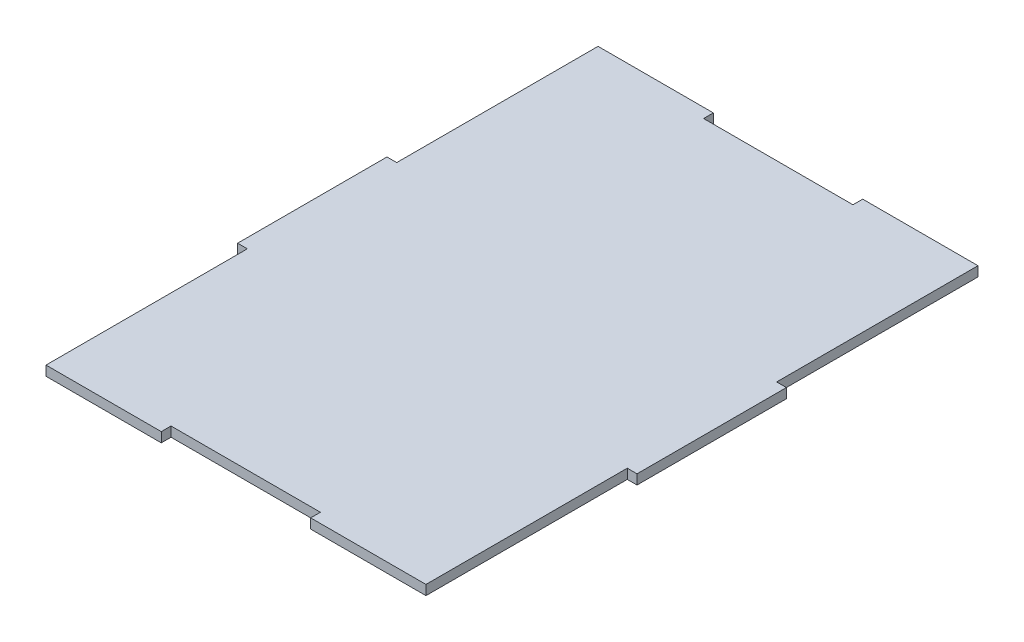
ISO-10303-21;
HEADER;
FILE_DESCRIPTION(('STEP AP214'),'2;1');
FILE_NAME('part.step','',(''),(''),'','','');
FILE_SCHEMA(('AUTOMOTIVE_DESIGN { 1 0 10303 214 1 1 1 1 }'));
ENDSEC;
DATA;
#1=APPLICATION_CONTEXT('core data for automotive mechanical design processes');
#2=APPLICATION_PROTOCOL_DEFINITION('international standard','automotive_design',2000,#1);
#3=PRODUCT_CONTEXT('',#1,'mechanical');
#4=PRODUCT('Part','Part','',(#3));
#5=PRODUCT_RELATED_PRODUCT_CATEGORY('part','',(#4));
#6=PRODUCT_DEFINITION_FORMATION('','',#4);
#7=PRODUCT_DEFINITION_CONTEXT('part definition',#1,'design');
#8=PRODUCT_DEFINITION('design','',#6,#7);
#9=PRODUCT_DEFINITION_SHAPE('','',#8);
#10=(LENGTH_UNIT() NAMED_UNIT(*) SI_UNIT(.MILLI.,.METRE.));
#11=(NAMED_UNIT(*) PLANE_ANGLE_UNIT() SI_UNIT($,.RADIAN.));
#12=(NAMED_UNIT(*) SI_UNIT($,.STERADIAN.) SOLID_ANGLE_UNIT());
#13=UNCERTAINTY_MEASURE_WITH_UNIT(LENGTH_MEASURE(1.E-05),#10,'distance_accuracy_value','');
#14=(GEOMETRIC_REPRESENTATION_CONTEXT(3) GLOBAL_UNCERTAINTY_ASSIGNED_CONTEXT((#13)) GLOBAL_UNIT_ASSIGNED_CONTEXT((#10,
#11,#12)) REPRESENTATION_CONTEXT('',''));
#15=CARTESIAN_POINT('',(0.,0.,0.));
#16=DIRECTION('',(0.,0.,1.));
#17=DIRECTION('',(1.,0.,0.));
#18=AXIS2_PLACEMENT_3D('',#15,#16,#17);
#19=CARTESIAN_POINT('',(3.00000000000004,3.,-170.));
#20=DIRECTION('',(1.,0.,0.));
#21=DIRECTION('',(0.,0.,-1.));
#22=AXIS2_PLACEMENT_3D('',#19,#20,#21);
#23=PLANE('',#22);
#24=DIRECTION('',(0.,0.,1.));
#25=VECTOR('',#24,1.);
#26=CARTESIAN_POINT('',(3.00000000000004,0.,-170.));
#27=LINE('',#26,#25);
#28=CARTESIAN_POINT('',(3.00000000000004,0.,-170.));
#29=VERTEX_POINT('',#28);
#30=CARTESIAN_POINT('',(3.,0.,-108.));
#31=VERTEX_POINT('',#30);
#32=EDGE_CURVE('E212',#29,#31,#27,.T.);
#33=ORIENTED_EDGE('',*,*,#32,.T.);
#34=DIRECTION('',(0.,-1.,0.));
#35=VECTOR('',#34,1.);
#36=CARTESIAN_POINT('',(3.,3.,-108.));
#37=LINE('',#36,#35);
#38=CARTESIAN_POINT('',(3.,3.,-108.));
#39=VERTEX_POINT('',#38);
#40=EDGE_CURVE('E11',#39,#31,#37,.T.);
#41=ORIENTED_EDGE('',*,*,#40,.F.);
#42=DIRECTION('',(0.,0.,1.));
#43=VECTOR('',#42,1.);
#44=CARTESIAN_POINT('',(3.00000000000004,3.,-170.));
#45=LINE('',#44,#43);
#46=CARTESIAN_POINT('',(3.00000000000004,3.,-170.));
#47=VERTEX_POINT('',#46);
#48=EDGE_CURVE('E270',#47,#39,#45,.T.);
#49=ORIENTED_EDGE('',*,*,#48,.F.);
#50=DIRECTION('',(0.,-1.,0.));
#51=VECTOR('',#50,1.);
#52=CARTESIAN_POINT('',(3.00000000000004,3.,-170.));
#53=LINE('',#52,#51);
#54=EDGE_CURVE('E208',#47,#29,#53,.T.);
#55=ORIENTED_EDGE('',*,*,#54,.T.);
#56=EDGE_LOOP('',(#33,#41,#49,#55));
#57=FACE_BOUND('',#56,.T.);
#58=ADVANCED_FACE('F39',(#57),#23,.F.);
#59=CARTESIAN_POINT('',(3.,3.,-108.));
#60=DIRECTION('',(0.,0.,1.));
#61=DIRECTION('',(1.,0.,0.));
#62=AXIS2_PLACEMENT_3D('',#59,#60,#61);
#63=PLANE('',#62);
#64=DIRECTION('',(-1.,0.,0.));
#65=VECTOR('',#64,1.);
#66=CARTESIAN_POINT('',(3.,0.,-108.));
#67=LINE('',#66,#65);
#68=CARTESIAN_POINT('',(0.,0.,-108.));
#69=VERTEX_POINT('',#68);
#70=EDGE_CURVE('E216',#31,#69,#67,.T.);
#71=ORIENTED_EDGE('',*,*,#70,.T.);
#72=DIRECTION('',(0.,-1.,0.));
#73=VECTOR('',#72,1.);
#74=CARTESIAN_POINT('',(0.,3.,-108.));
#75=LINE('',#74,#73);
#76=CARTESIAN_POINT('',(0.,3.,-108.));
#77=VERTEX_POINT('',#76);
#78=EDGE_CURVE('E48',#77,#69,#75,.T.);
#79=ORIENTED_EDGE('',*,*,#78,.F.);
#80=DIRECTION('',(-1.,0.,0.));
#81=VECTOR('',#80,1.);
#82=CARTESIAN_POINT('',(3.,3.,-108.));
#83=LINE('',#82,#81);
#84=EDGE_CURVE('E135',#39,#77,#83,.T.);
#85=ORIENTED_EDGE('',*,*,#84,.F.);
#86=ORIENTED_EDGE('',*,*,#40,.T.);
#87=EDGE_LOOP('',(#71,#79,#85,#86));
#88=FACE_BOUND('',#87,.T.);
#89=ADVANCED_FACE('F420',(#88),#63,.F.);
#90=CARTESIAN_POINT('',(0.,3.,-108.));
#91=DIRECTION('',(1.,0.,0.));
#92=DIRECTION('',(0.,0.,-1.));
#93=AXIS2_PLACEMENT_3D('',#90,#91,#92);
#94=PLANE('',#93);
#95=DIRECTION('',(0.,0.,1.));
#96=VECTOR('',#95,1.);
#97=CARTESIAN_POINT('',(0.,0.,-108.));
#98=LINE('',#97,#96);
#99=CARTESIAN_POINT('',(0.,0.,-62.));
#100=VERTEX_POINT('',#99);
#101=EDGE_CURVE('E219',#69,#100,#98,.T.);
#102=ORIENTED_EDGE('',*,*,#101,.T.);
#103=DIRECTION('',(0.,-1.,0.));
#104=VECTOR('',#103,1.);
#105=CARTESIAN_POINT('',(0.,3.,-62.));
#106=LINE('',#105,#104);
#107=CARTESIAN_POINT('',(0.,3.,-62.));
#108=VERTEX_POINT('',#107);
#109=EDGE_CURVE('E329',#108,#100,#106,.T.);
#110=ORIENTED_EDGE('',*,*,#109,.F.);
#111=DIRECTION('',(0.,0.,1.));
#112=VECTOR('',#111,1.);
#113=CARTESIAN_POINT('',(0.,3.,-108.));
#114=LINE('',#113,#112);
#115=EDGE_CURVE('E339',#77,#108,#114,.T.);
#116=ORIENTED_EDGE('',*,*,#115,.F.);
#117=ORIENTED_EDGE('',*,*,#78,.T.);
#118=EDGE_LOOP('',(#102,#110,#116,#117));
#119=FACE_BOUND('',#118,.T.);
#120=ADVANCED_FACE('F337',(#119),#94,.F.);
#121=CARTESIAN_POINT('',(3.,3.,-62.));
#122=DIRECTION('',(0.,0.,-1.));
#123=DIRECTION('',(-1.,0.,0.));
#124=AXIS2_PLACEMENT_3D('',#121,#122,#123);
#125=PLANE('',#124);
#126=DIRECTION('',(1.,0.,0.));
#127=VECTOR('',#126,1.);
#128=CARTESIAN_POINT('',(3.,0.,-62.));
#129=LINE('',#128,#127);
#130=CARTESIAN_POINT('',(3.,0.,-62.));
#131=VERTEX_POINT('',#130);
#132=EDGE_CURVE('E222',#100,#131,#129,.T.);
#133=ORIENTED_EDGE('',*,*,#132,.T.);
#134=DIRECTION('',(0.,-1.,0.));
#135=VECTOR('',#134,1.);
#136=CARTESIAN_POINT('',(3.,3.,-62.));
#137=LINE('',#136,#135);
#138=CARTESIAN_POINT('',(3.,3.,-62.));
#139=VERTEX_POINT('',#138);
#140=EDGE_CURVE('E325',#139,#131,#137,.T.);
#141=ORIENTED_EDGE('',*,*,#140,.F.);
#142=DIRECTION('',(1.,0.,0.));
#143=VECTOR('',#142,1.);
#144=CARTESIAN_POINT('',(3.,3.,-62.));
#145=LINE('',#144,#143);
#146=EDGE_CURVE('E358',#108,#139,#145,.T.);
#147=ORIENTED_EDGE('',*,*,#146,.F.);
#148=ORIENTED_EDGE('',*,*,#109,.T.);
#149=EDGE_LOOP('',(#133,#141,#147,#148));
#150=FACE_BOUND('',#149,.T.);
#151=ADVANCED_FACE('F348',(#150),#125,.F.);
#152=CARTESIAN_POINT('',(3.,3.,-62.));
#153=DIRECTION('',(1.,0.,0.));
#154=DIRECTION('',(0.,0.,-1.));
#155=AXIS2_PLACEMENT_3D('',#152,#153,#154);
#156=PLANE('',#155);
#157=DIRECTION('',(0.,0.,1.));
#158=VECTOR('',#157,1.);
#159=CARTESIAN_POINT('',(3.,0.,-62.));
#160=LINE('',#159,#158);
#161=CARTESIAN_POINT('',(3.,0.,0.));
#162=VERTEX_POINT('',#161);
#163=EDGE_CURVE('E225',#131,#162,#160,.T.);
#164=ORIENTED_EDGE('',*,*,#163,.T.);
#165=DIRECTION('',(0.,-1.,0.));
#166=VECTOR('',#165,1.);
#167=CARTESIAN_POINT('',(3.,3.,0.));
#168=LINE('',#167,#166);
#169=CARTESIAN_POINT('',(3.,3.,0.));
#170=VERTEX_POINT('',#169);
#171=EDGE_CURVE('E321',#170,#162,#168,.T.);
#172=ORIENTED_EDGE('',*,*,#171,.F.);
#173=DIRECTION('',(0.,0.,1.));
#174=VECTOR('',#173,1.);
#175=CARTESIAN_POINT('',(3.,3.,-62.));
#176=LINE('',#175,#174);
#177=EDGE_CURVE('E354',#139,#170,#176,.T.);
#178=ORIENTED_EDGE('',*,*,#177,.F.);
#179=ORIENTED_EDGE('',*,*,#140,.T.);
#180=EDGE_LOOP('',(#164,#172,#178,#179));
#181=FACE_BOUND('',#180,.T.);
#182=ADVANCED_FACE('F352',(#181),#156,.F.);
#183=CARTESIAN_POINT('',(3.,3.,0.));
#184=DIRECTION('',(0.,0.,-1.));
#185=DIRECTION('',(-1.,0.,0.));
#186=AXIS2_PLACEMENT_3D('',#183,#184,#185);
#187=PLANE('',#186);
#188=DIRECTION('',(1.,0.,0.));
#189=VECTOR('',#188,1.);
#190=CARTESIAN_POINT('',(3.,0.,0.));
#191=LINE('',#190,#189);
#192=CARTESIAN_POINT('',(38.5,0.,0.));
#193=VERTEX_POINT('',#192);
#194=EDGE_CURVE('E228',#162,#193,#191,.T.);
#195=ORIENTED_EDGE('',*,*,#194,.T.);
#196=DIRECTION('',(0.,-1.,0.));
#197=VECTOR('',#196,1.);
#198=CARTESIAN_POINT('',(38.5,3.,0.));
#199=LINE('',#198,#197);
#200=CARTESIAN_POINT('',(38.5,3.,0.));
#201=VERTEX_POINT('',#200);
#202=EDGE_CURVE('E317',#201,#193,#199,.T.);
#203=ORIENTED_EDGE('',*,*,#202,.F.);
#204=DIRECTION('',(1.,0.,0.));
#205=VECTOR('',#204,1.);
#206=CARTESIAN_POINT('',(3.,3.,0.));
#207=LINE('',#206,#205);
#208=EDGE_CURVE('E357',#170,#201,#207,.T.);
#209=ORIENTED_EDGE('',*,*,#208,.F.);
#210=ORIENTED_EDGE('',*,*,#171,.T.);
#211=EDGE_LOOP('',(#195,#203,#209,#210));
#212=FACE_BOUND('',#211,.T.);
#213=ADVANCED_FACE('F433',(#212),#187,.F.);
#214=CARTESIAN_POINT('',(38.5,3.,0.));
#215=DIRECTION('',(-1.,0.,0.));
#216=DIRECTION('',(0.,0.,1.));
#217=AXIS2_PLACEMENT_3D('',#214,#215,#216);
#218=PLANE('',#217);
#219=DIRECTION('',(0.,0.,-1.));
#220=VECTOR('',#219,1.);
#221=CARTESIAN_POINT('',(38.5,0.,0.));
#222=LINE('',#221,#220);
#223=CARTESIAN_POINT('',(38.5,0.,-3.00000000000003));
#224=VERTEX_POINT('',#223);
#225=EDGE_CURVE('E231',#193,#224,#222,.T.);
#226=ORIENTED_EDGE('',*,*,#225,.T.);
#227=DIRECTION('',(0.,-1.,0.));
#228=VECTOR('',#227,1.);
#229=CARTESIAN_POINT('',(38.5,3.,-3.00000000000003));
#230=LINE('',#229,#228);
#231=CARTESIAN_POINT('',(38.5,3.,-3.00000000000003));
#232=VERTEX_POINT('',#231);
#233=EDGE_CURVE('E313',#232,#224,#230,.T.);
#234=ORIENTED_EDGE('',*,*,#233,.F.);
#235=DIRECTION('',(0.,0.,-1.));
#236=VECTOR('',#235,1.);
#237=CARTESIAN_POINT('',(38.5,3.,0.));
#238=LINE('',#237,#236);
#239=EDGE_CURVE('E362',#201,#232,#238,.T.);
#240=ORIENTED_EDGE('',*,*,#239,.F.);
#241=ORIENTED_EDGE('',*,*,#202,.T.);
#242=EDGE_LOOP('',(#226,#234,#240,#241));
#243=FACE_BOUND('',#242,.T.);
#244=ADVANCED_FACE('F436',(#243),#218,.F.);
#245=CARTESIAN_POINT('',(84.5,3.,-3.00000000000004));
#246=DIRECTION('',(0.,0.,-1.));
#247=DIRECTION('',(-1.,0.,0.));
#248=AXIS2_PLACEMENT_3D('',#245,#246,#247);
#249=PLANE('',#248);
#250=DIRECTION('',(1.,0.,0.));
#251=VECTOR('',#250,1.);
#252=CARTESIAN_POINT('',(84.5,0.,-3.00000000000004));
#253=LINE('',#252,#251);
#254=CARTESIAN_POINT('',(84.5,0.,-3.00000000000004));
#255=VERTEX_POINT('',#254);
#256=EDGE_CURVE('E234',#224,#255,#253,.T.);
#257=ORIENTED_EDGE('',*,*,#256,.T.);
#258=DIRECTION('',(0.,-1.,0.));
#259=VECTOR('',#258,1.);
#260=CARTESIAN_POINT('',(84.5,3.,-3.00000000000004));
#261=LINE('',#260,#259);
#262=CARTESIAN_POINT('',(84.5,3.,-3.00000000000004));
#263=VERTEX_POINT('',#262);
#264=EDGE_CURVE('E309',#263,#255,#261,.T.);
#265=ORIENTED_EDGE('',*,*,#264,.F.);
#266=DIRECTION('',(1.,0.,0.));
#267=VECTOR('',#266,1.);
#268=CARTESIAN_POINT('',(84.5,3.,-3.00000000000004));
#269=LINE('',#268,#267);
#270=EDGE_CURVE('E369',#232,#263,#269,.T.);
#271=ORIENTED_EDGE('',*,*,#270,.F.);
#272=ORIENTED_EDGE('',*,*,#233,.T.);
#273=EDGE_LOOP('',(#257,#265,#271,#272));
#274=FACE_BOUND('',#273,.T.);
#275=ADVANCED_FACE('F440',(#274),#249,.F.);
#276=CARTESIAN_POINT('',(84.5000000000001,3.,0.));
#277=DIRECTION('',(1.,0.,0.));
#278=DIRECTION('',(0.,0.,-1.));
#279=AXIS2_PLACEMENT_3D('',#276,#277,#278);
#280=PLANE('',#279);
#281=DIRECTION('',(0.,0.,1.));
#282=VECTOR('',#281,1.);
#283=CARTESIAN_POINT('',(84.5000000000001,0.,0.));
#284=LINE('',#283,#282);
#285=CARTESIAN_POINT('',(84.5000000000001,0.,0.));
#286=VERTEX_POINT('',#285);
#287=EDGE_CURVE('E237',#255,#286,#284,.T.);
#288=ORIENTED_EDGE('',*,*,#287,.T.);
#289=DIRECTION('',(0.,-1.,0.));
#290=VECTOR('',#289,1.);
#291=CARTESIAN_POINT('',(84.5000000000001,3.,0.));
#292=LINE('',#291,#290);
#293=CARTESIAN_POINT('',(84.5000000000001,3.,0.));
#294=VERTEX_POINT('',#293);
#295=EDGE_CURVE('E305',#294,#286,#292,.T.);
#296=ORIENTED_EDGE('',*,*,#295,.F.);
#297=DIRECTION('',(0.,0.,1.));
#298=VECTOR('',#297,1.);
#299=CARTESIAN_POINT('',(84.5000000000001,3.,0.));
#300=LINE('',#299,#298);
#301=EDGE_CURVE('E372',#263,#294,#300,.T.);
#302=ORIENTED_EDGE('',*,*,#301,.F.);
#303=ORIENTED_EDGE('',*,*,#264,.T.);
#304=EDGE_LOOP('',(#288,#296,#302,#303));
#305=FACE_BOUND('',#304,.T.);
#306=ADVANCED_FACE('F444',(#305),#280,.F.);
#307=CARTESIAN_POINT('',(84.5000000000001,3.,0.));
#308=DIRECTION('',(0.,0.,-1.));
#309=DIRECTION('',(-1.,0.,0.));
#310=AXIS2_PLACEMENT_3D('',#307,#308,#309);
#311=PLANE('',#310);
#312=DIRECTION('',(1.,0.,0.));
#313=VECTOR('',#312,1.);
#314=CARTESIAN_POINT('',(84.5000000000001,0.,0.));
#315=LINE('',#314,#313);
#316=CARTESIAN_POINT('',(120.,0.,0.));
#317=VERTEX_POINT('',#316);
#318=EDGE_CURVE('E240',#286,#317,#315,.T.);
#319=ORIENTED_EDGE('',*,*,#318,.T.);
#320=DIRECTION('',(0.,-1.,0.));
#321=VECTOR('',#320,1.);
#322=CARTESIAN_POINT('',(120.,3.,0.));
#323=LINE('',#322,#321);
#324=CARTESIAN_POINT('',(120.,3.,0.));
#325=VERTEX_POINT('',#324);
#326=EDGE_CURVE('E301',#325,#317,#323,.T.);
#327=ORIENTED_EDGE('',*,*,#326,.F.);
#328=DIRECTION('',(1.,0.,0.));
#329=VECTOR('',#328,1.);
#330=CARTESIAN_POINT('',(84.5000000000001,3.,0.));
#331=LINE('',#330,#329);
#332=EDGE_CURVE('E375',#294,#325,#331,.T.);
#333=ORIENTED_EDGE('',*,*,#332,.F.);
#334=ORIENTED_EDGE('',*,*,#295,.T.);
#335=EDGE_LOOP('',(#319,#327,#333,#334));
#336=FACE_BOUND('',#335,.T.);
#337=ADVANCED_FACE('F448',(#336),#311,.F.);
#338=CARTESIAN_POINT('',(120.,3.,-62.));
#339=DIRECTION('',(-1.,0.,0.));
#340=DIRECTION('',(0.,0.,1.));
#341=AXIS2_PLACEMENT_3D('',#338,#339,#340);
#342=PLANE('',#341);
#343=DIRECTION('',(0.,0.,-1.));
#344=VECTOR('',#343,1.);
#345=CARTESIAN_POINT('',(120.,0.,-62.));
#346=LINE('',#345,#344);
#347=CARTESIAN_POINT('',(120.,0.,-62.));
#348=VERTEX_POINT('',#347);
#349=EDGE_CURVE('E243',#317,#348,#346,.T.);
#350=ORIENTED_EDGE('',*,*,#349,.T.);
#351=DIRECTION('',(0.,-1.,0.));
#352=VECTOR('',#351,1.);
#353=CARTESIAN_POINT('',(120.,3.,-62.));
#354=LINE('',#353,#352);
#355=CARTESIAN_POINT('',(120.,3.,-62.));
#356=VERTEX_POINT('',#355);
#357=EDGE_CURVE('E297',#356,#348,#354,.T.);
#358=ORIENTED_EDGE('',*,*,#357,.F.);
#359=DIRECTION('',(0.,0.,-1.));
#360=VECTOR('',#359,1.);
#361=CARTESIAN_POINT('',(120.,3.,-62.));
#362=LINE('',#361,#360);
#363=EDGE_CURVE('E378',#325,#356,#362,.T.);
#364=ORIENTED_EDGE('',*,*,#363,.F.);
#365=ORIENTED_EDGE('',*,*,#326,.T.);
#366=EDGE_LOOP('',(#350,#358,#364,#365));
#367=FACE_BOUND('',#366,.T.);
#368=ADVANCED_FACE('F452',(#367),#342,.F.);
#369=CARTESIAN_POINT('',(120.,3.,-62.));
#370=DIRECTION('',(0.,0.,-1.));
#371=DIRECTION('',(-1.,0.,0.));
#372=AXIS2_PLACEMENT_3D('',#369,#370,#371);
#373=PLANE('',#372);
#374=DIRECTION('',(1.,0.,0.));
#375=VECTOR('',#374,1.);
#376=CARTESIAN_POINT('',(120.,0.,-62.));
#377=LINE('',#376,#375);
#378=CARTESIAN_POINT('',(123.,0.,-62.));
#379=VERTEX_POINT('',#378);
#380=EDGE_CURVE('E246',#348,#379,#377,.T.);
#381=ORIENTED_EDGE('',*,*,#380,.T.);
#382=DIRECTION('',(0.,-1.,0.));
#383=VECTOR('',#382,1.);
#384=CARTESIAN_POINT('',(123.,3.,-62.));
#385=LINE('',#384,#383);
#386=CARTESIAN_POINT('',(123.,3.,-62.));
#387=VERTEX_POINT('',#386);
#388=EDGE_CURVE('E293',#387,#379,#385,.T.);
#389=ORIENTED_EDGE('',*,*,#388,.F.);
#390=DIRECTION('',(1.,0.,0.));
#391=VECTOR('',#390,1.);
#392=CARTESIAN_POINT('',(120.,3.,-62.));
#393=LINE('',#392,#391);
#394=EDGE_CURVE('E381',#356,#387,#393,.T.);
#395=ORIENTED_EDGE('',*,*,#394,.F.);
#396=ORIENTED_EDGE('',*,*,#357,.T.);
#397=EDGE_LOOP('',(#381,#389,#395,#396));
#398=FACE_BOUND('',#397,.T.);
#399=ADVANCED_FACE('F456',(#398),#373,.F.);
#400=CARTESIAN_POINT('',(123.,3.,-108.));
#401=DIRECTION('',(-1.,0.,0.));
#402=DIRECTION('',(0.,0.,1.));
#403=AXIS2_PLACEMENT_3D('',#400,#401,#402);
#404=PLANE('',#403);
#405=DIRECTION('',(0.,0.,-1.));
#406=VECTOR('',#405,1.);
#407=CARTESIAN_POINT('',(123.,0.,-108.));
#408=LINE('',#407,#406);
#409=CARTESIAN_POINT('',(123.,0.,-108.));
#410=VERTEX_POINT('',#409);
#411=EDGE_CURVE('E249',#379,#410,#408,.T.);
#412=ORIENTED_EDGE('',*,*,#411,.T.);
#413=DIRECTION('',(0.,-1.,0.));
#414=VECTOR('',#413,1.);
#415=CARTESIAN_POINT('',(123.,3.,-108.));
#416=LINE('',#415,#414);
#417=CARTESIAN_POINT('',(123.,3.,-108.));
#418=VERTEX_POINT('',#417);
#419=EDGE_CURVE('E289',#418,#410,#416,.T.);
#420=ORIENTED_EDGE('',*,*,#419,.F.);
#421=DIRECTION('',(0.,0.,-1.));
#422=VECTOR('',#421,1.);
#423=CARTESIAN_POINT('',(123.,3.,-108.));
#424=LINE('',#423,#422);
#425=EDGE_CURVE('E384',#387,#418,#424,.T.);
#426=ORIENTED_EDGE('',*,*,#425,.F.);
#427=ORIENTED_EDGE('',*,*,#388,.T.);
#428=EDGE_LOOP('',(#412,#420,#426,#427));
#429=FACE_BOUND('',#428,.T.);
#430=ADVANCED_FACE('F460',(#429),#404,.F.);
#431=CARTESIAN_POINT('',(120.,3.,-108.));
#432=DIRECTION('',(0.,0.,1.));
#433=DIRECTION('',(1.,0.,0.));
#434=AXIS2_PLACEMENT_3D('',#431,#432,#433);
#435=PLANE('',#434);
#436=DIRECTION('',(-1.,0.,0.));
#437=VECTOR('',#436,1.);
#438=CARTESIAN_POINT('',(120.,0.,-108.));
#439=LINE('',#438,#437);
#440=CARTESIAN_POINT('',(120.,0.,-108.));
#441=VERTEX_POINT('',#440);
#442=EDGE_CURVE('E252',#410,#441,#439,.T.);
#443=ORIENTED_EDGE('',*,*,#442,.T.);
#444=DIRECTION('',(0.,-1.,0.));
#445=VECTOR('',#444,1.);
#446=CARTESIAN_POINT('',(120.,3.,-108.));
#447=LINE('',#446,#445);
#448=CARTESIAN_POINT('',(120.,3.,-108.));
#449=VERTEX_POINT('',#448);
#450=EDGE_CURVE('E285',#449,#441,#447,.T.);
#451=ORIENTED_EDGE('',*,*,#450,.F.);
#452=DIRECTION('',(-1.,0.,0.));
#453=VECTOR('',#452,1.);
#454=CARTESIAN_POINT('',(120.,3.,-108.));
#455=LINE('',#454,#453);
#456=EDGE_CURVE('E387',#418,#449,#455,.T.);
#457=ORIENTED_EDGE('',*,*,#456,.F.);
#458=ORIENTED_EDGE('',*,*,#419,.T.);
#459=EDGE_LOOP('',(#443,#451,#457,#458));
#460=FACE_BOUND('',#459,.T.);
#461=ADVANCED_FACE('F464',(#460),#435,.F.);
#462=CARTESIAN_POINT('',(120.,3.,-170.));
#463=DIRECTION('',(-1.,0.,0.));
#464=DIRECTION('',(0.,0.,1.));
#465=AXIS2_PLACEMENT_3D('',#462,#463,#464);
#466=PLANE('',#465);
#467=DIRECTION('',(0.,0.,-1.));
#468=VECTOR('',#467,1.);
#469=CARTESIAN_POINT('',(120.,0.,-170.));
#470=LINE('',#469,#468);
#471=CARTESIAN_POINT('',(120.,0.,-170.));
#472=VERTEX_POINT('',#471);
#473=EDGE_CURVE('E255',#441,#472,#470,.T.);
#474=ORIENTED_EDGE('',*,*,#473,.T.);
#475=DIRECTION('',(0.,-1.,0.));
#476=VECTOR('',#475,1.);
#477=CARTESIAN_POINT('',(120.,3.,-170.));
#478=LINE('',#477,#476);
#479=CARTESIAN_POINT('',(120.,3.,-170.));
#480=VERTEX_POINT('',#479);
#481=EDGE_CURVE('E281',#480,#472,#478,.T.);
#482=ORIENTED_EDGE('',*,*,#481,.F.);
#483=DIRECTION('',(0.,0.,-1.));
#484=VECTOR('',#483,1.);
#485=CARTESIAN_POINT('',(120.,3.,-170.));
#486=LINE('',#485,#484);
#487=EDGE_CURVE('E390',#449,#480,#486,.T.);
#488=ORIENTED_EDGE('',*,*,#487,.F.);
#489=ORIENTED_EDGE('',*,*,#450,.T.);
#490=EDGE_LOOP('',(#474,#482,#488,#489));
#491=FACE_BOUND('',#490,.T.);
#492=ADVANCED_FACE('F468',(#491),#466,.F.);
#493=CARTESIAN_POINT('',(84.4999999999999,3.,-170.));
#494=DIRECTION('',(0.,0.,1.));
#495=DIRECTION('',(1.,0.,0.));
#496=AXIS2_PLACEMENT_3D('',#493,#494,#495);
#497=PLANE('',#496);
#498=DIRECTION('',(-1.,0.,0.));
#499=VECTOR('',#498,1.);
#500=CARTESIAN_POINT('',(84.4999999999999,0.,-170.));
#501=LINE('',#500,#499);
#502=CARTESIAN_POINT('',(84.4999999999999,0.,-170.));
#503=VERTEX_POINT('',#502);
#504=EDGE_CURVE('E258',#472,#503,#501,.T.);
#505=ORIENTED_EDGE('',*,*,#504,.T.);
#506=DIRECTION('',(0.,-1.,0.));
#507=VECTOR('',#506,1.);
#508=CARTESIAN_POINT('',(84.4999999999999,3.,-170.));
#509=LINE('',#508,#507);
#510=CARTESIAN_POINT('',(84.4999999999999,3.,-170.));
#511=VERTEX_POINT('',#510);
#512=EDGE_CURVE('E277',#511,#503,#509,.T.);
#513=ORIENTED_EDGE('',*,*,#512,.F.);
#514=DIRECTION('',(-1.,0.,0.));
#515=VECTOR('',#514,1.);
#516=CARTESIAN_POINT('',(84.4999999999999,3.,-170.));
#517=LINE('',#516,#515);
#518=EDGE_CURVE('E393',#480,#511,#517,.T.);
#519=ORIENTED_EDGE('',*,*,#518,.F.);
#520=ORIENTED_EDGE('',*,*,#481,.T.);
#521=EDGE_LOOP('',(#505,#513,#519,#520));
#522=FACE_BOUND('',#521,.T.);
#523=ADVANCED_FACE('F401',(#522),#497,.F.);
#524=CARTESIAN_POINT('',(84.4999999999999,3.,-170.));
#525=DIRECTION('',(1.,0.,0.));
#526=DIRECTION('',(0.,0.,-1.));
#527=AXIS2_PLACEMENT_3D('',#524,#525,#526);
#528=PLANE('',#527);
#529=DIRECTION('',(0.,0.,1.));
#530=VECTOR('',#529,1.);
#531=CARTESIAN_POINT('',(84.4999999999999,0.,-170.));
#532=LINE('',#531,#530);
#533=CARTESIAN_POINT('',(84.4999999999999,0.,-167.));
#534=VERTEX_POINT('',#533);
#535=EDGE_CURVE('E261',#503,#534,#532,.T.);
#536=ORIENTED_EDGE('',*,*,#535,.T.);
#537=DIRECTION('',(0.,-1.,0.));
#538=VECTOR('',#537,1.);
#539=CARTESIAN_POINT('',(84.4999999999999,3.,-167.));
#540=LINE('',#539,#538);
#541=CARTESIAN_POINT('',(84.4999999999999,3.,-167.));
#542=VERTEX_POINT('',#541);
#543=EDGE_CURVE('E201',#542,#534,#540,.T.);
#544=ORIENTED_EDGE('',*,*,#543,.F.);
#545=DIRECTION('',(0.,0.,1.));
#546=VECTOR('',#545,1.);
#547=CARTESIAN_POINT('',(84.4999999999999,3.,-170.));
#548=LINE('',#547,#546);
#549=EDGE_CURVE('E190',#511,#542,#548,.T.);
#550=ORIENTED_EDGE('',*,*,#549,.F.);
#551=ORIENTED_EDGE('',*,*,#512,.T.);
#552=EDGE_LOOP('',(#536,#544,#550,#551));
#553=FACE_BOUND('',#552,.T.);
#554=ADVANCED_FACE('F405',(#553),#528,.F.);
#555=CARTESIAN_POINT('',(38.5,3.,-167.));
#556=DIRECTION('',(0.,0.,1.));
#557=DIRECTION('',(1.,0.,0.));
#558=AXIS2_PLACEMENT_3D('',#555,#556,#557);
#559=PLANE('',#558);
#560=DIRECTION('',(-1.,0.,0.));
#561=VECTOR('',#560,1.);
#562=CARTESIAN_POINT('',(38.5,0.,-167.));
#563=LINE('',#562,#561);
#564=CARTESIAN_POINT('',(38.5,0.,-167.));
#565=VERTEX_POINT('',#564);
#566=EDGE_CURVE('E199',#534,#565,#563,.T.);
#567=ORIENTED_EDGE('',*,*,#566,.T.);
#568=DIRECTION('',(0.,-1.,0.));
#569=VECTOR('',#568,1.);
#570=CARTESIAN_POINT('',(38.5,3.,-167.));
#571=LINE('',#570,#569);
#572=CARTESIAN_POINT('',(38.5,3.,-167.));
#573=VERTEX_POINT('',#572);
#574=EDGE_CURVE('E196',#573,#565,#571,.T.);
#575=ORIENTED_EDGE('',*,*,#574,.F.);
#576=DIRECTION('',(-1.,0.,0.));
#577=VECTOR('',#576,1.);
#578=CARTESIAN_POINT('',(38.5,3.,-167.));
#579=LINE('',#578,#577);
#580=EDGE_CURVE('E184',#542,#573,#579,.T.);
#581=ORIENTED_EDGE('',*,*,#580,.F.);
#582=ORIENTED_EDGE('',*,*,#543,.T.);
#583=EDGE_LOOP('',(#567,#575,#581,#582));
#584=FACE_BOUND('',#583,.T.);
#585=ADVANCED_FACE('F197',(#584),#559,.F.);
#586=CARTESIAN_POINT('',(38.5000000000001,3.,-170.));
#587=DIRECTION('',(-1.,0.,0.));
#588=DIRECTION('',(0.,0.,1.));
#589=AXIS2_PLACEMENT_3D('',#586,#587,#588);
#590=PLANE('',#589);
#591=DIRECTION('',(0.,0.,-1.));
#592=VECTOR('',#591,1.);
#593=CARTESIAN_POINT('',(38.5000000000001,0.,-170.));
#594=LINE('',#593,#592);
#595=CARTESIAN_POINT('',(38.5000000000001,0.,-170.));
#596=VERTEX_POINT('',#595);
#597=EDGE_CURVE('E121',#565,#596,#594,.T.);
#598=ORIENTED_EDGE('',*,*,#597,.T.);
#599=DIRECTION('',(0.,-1.,0.));
#600=VECTOR('',#599,1.);
#601=CARTESIAN_POINT('',(38.5000000000001,3.,-170.));
#602=LINE('',#601,#600);
#603=CARTESIAN_POINT('',(38.5000000000001,3.,-170.));
#604=VERTEX_POINT('',#603);
#605=EDGE_CURVE('E202',#604,#596,#602,.T.);
#606=ORIENTED_EDGE('',*,*,#605,.F.);
#607=DIRECTION('',(0.,0.,-1.));
#608=VECTOR('',#607,1.);
#609=CARTESIAN_POINT('',(38.5000000000001,3.,-170.));
#610=LINE('',#609,#608);
#611=EDGE_CURVE('E188',#573,#604,#610,.T.);
#612=ORIENTED_EDGE('',*,*,#611,.F.);
#613=ORIENTED_EDGE('',*,*,#574,.T.);
#614=EDGE_LOOP('',(#598,#606,#612,#613));
#615=FACE_BOUND('',#614,.T.);
#616=ADVANCED_FACE('F204',(#615),#590,.F.);
#617=CARTESIAN_POINT('',(3.00000000000004,3.,-170.));
#618=DIRECTION('',(0.,0.,1.));
#619=DIRECTION('',(1.,0.,0.));
#620=AXIS2_PLACEMENT_3D('',#617,#618,#619);
#621=PLANE('',#620);
#622=DIRECTION('',(-1.,0.,0.));
#623=VECTOR('',#622,1.);
#624=CARTESIAN_POINT('',(3.00000000000004,0.,-170.));
#625=LINE('',#624,#623);
#626=EDGE_CURVE('E127',#596,#29,#625,.T.);
#627=ORIENTED_EDGE('',*,*,#626,.T.);
#628=ORIENTED_EDGE('',*,*,#54,.F.);
#629=DIRECTION('',(-1.,0.,0.));
#630=VECTOR('',#629,1.);
#631=CARTESIAN_POINT('',(3.00000000000004,3.,-170.));
#632=LINE('',#631,#630);
#633=EDGE_CURVE('E56',#604,#47,#632,.T.);
#634=ORIENTED_EDGE('',*,*,#633,.F.);
#635=ORIENTED_EDGE('',*,*,#605,.T.);
#636=EDGE_LOOP('',(#627,#628,#634,#635));
#637=FACE_BOUND('',#636,.T.);
#638=ADVANCED_FACE('F409',(#637),#621,.F.);
#639=CARTESIAN_POINT('',(0.,3.,0.));
#640=DIRECTION('',(0.,-1.,0.));
#641=DIRECTION('',(0.,0.,-1.));
#642=AXIS2_PLACEMENT_3D('',#639,#640,#641);
#643=PLANE('',#642);
#644=ORIENTED_EDGE('',*,*,#48,.T.);
#645=ORIENTED_EDGE('',*,*,#84,.T.);
#646=ORIENTED_EDGE('',*,*,#115,.T.);
#647=ORIENTED_EDGE('',*,*,#146,.T.);
#648=ORIENTED_EDGE('',*,*,#177,.T.);
#649=ORIENTED_EDGE('',*,*,#208,.T.);
#650=ORIENTED_EDGE('',*,*,#239,.T.);
#651=ORIENTED_EDGE('',*,*,#270,.T.);
#652=ORIENTED_EDGE('',*,*,#301,.T.);
#653=ORIENTED_EDGE('',*,*,#332,.T.);
#654=ORIENTED_EDGE('',*,*,#363,.T.);
#655=ORIENTED_EDGE('',*,*,#394,.T.);
#656=ORIENTED_EDGE('',*,*,#425,.T.);
#657=ORIENTED_EDGE('',*,*,#456,.T.);
#658=ORIENTED_EDGE('',*,*,#487,.T.);
#659=ORIENTED_EDGE('',*,*,#518,.T.);
#660=ORIENTED_EDGE('',*,*,#549,.T.);
#661=ORIENTED_EDGE('',*,*,#580,.T.);
#662=ORIENTED_EDGE('',*,*,#611,.T.);
#663=ORIENTED_EDGE('',*,*,#633,.T.);
#664=EDGE_LOOP('',(#644,#645,#646,#647,#648,#649,#650,#651,#652,#653,#654,#655,#656,#657,#658,
#659,#660,#661,#662,#663));
#665=FACE_BOUND('',#664,.T.);
#666=ADVANCED_FACE('F186',(#665),#643,.F.);
#667=CARTESIAN_POINT('',(0.,0.,0.));
#668=DIRECTION('',(0.,-1.,0.));
#669=DIRECTION('',(0.,0.,-1.));
#670=AXIS2_PLACEMENT_3D('',#667,#668,#669);
#671=PLANE('',#670);
#672=ORIENTED_EDGE('',*,*,#32,.F.);
#673=ORIENTED_EDGE('',*,*,#626,.F.);
#674=ORIENTED_EDGE('',*,*,#597,.F.);
#675=ORIENTED_EDGE('',*,*,#566,.F.);
#676=ORIENTED_EDGE('',*,*,#535,.F.);
#677=ORIENTED_EDGE('',*,*,#504,.F.);
#678=ORIENTED_EDGE('',*,*,#473,.F.);
#679=ORIENTED_EDGE('',*,*,#442,.F.);
#680=ORIENTED_EDGE('',*,*,#411,.F.);
#681=ORIENTED_EDGE('',*,*,#380,.F.);
#682=ORIENTED_EDGE('',*,*,#349,.F.);
#683=ORIENTED_EDGE('',*,*,#318,.F.);
#684=ORIENTED_EDGE('',*,*,#287,.F.);
#685=ORIENTED_EDGE('',*,*,#256,.F.);
#686=ORIENTED_EDGE('',*,*,#225,.F.);
#687=ORIENTED_EDGE('',*,*,#194,.F.);
#688=ORIENTED_EDGE('',*,*,#163,.F.);
#689=ORIENTED_EDGE('',*,*,#132,.F.);
#690=ORIENTED_EDGE('',*,*,#101,.F.);
#691=ORIENTED_EDGE('',*,*,#70,.F.);
#692=EDGE_LOOP('',(#672,#673,#674,#675,#676,#677,#678,#679,#680,#681,#682,#683,#684,#685,#686,
#687,#688,#689,#690,#691));
#693=FACE_BOUND('',#692,.T.);
#694=ADVANCED_FACE('F343',(#693),#671,.T.);
#695=CLOSED_SHELL('',(#58,#89,#120,#151,#182,#213,#244,#275,#306,#337,#368,#399,#430,#461,#492,
#523,#554,#585,#616,#638,#666,#694));
#696=MANIFOLD_SOLID_BREP('B2',#695);
#697=ADVANCED_BREP_SHAPE_REPRESENTATION('',(#18,#696),#14);
#698=SHAPE_DEFINITION_REPRESENTATION(#9,#697);
ENDSEC;
END-ISO-10303-21;
